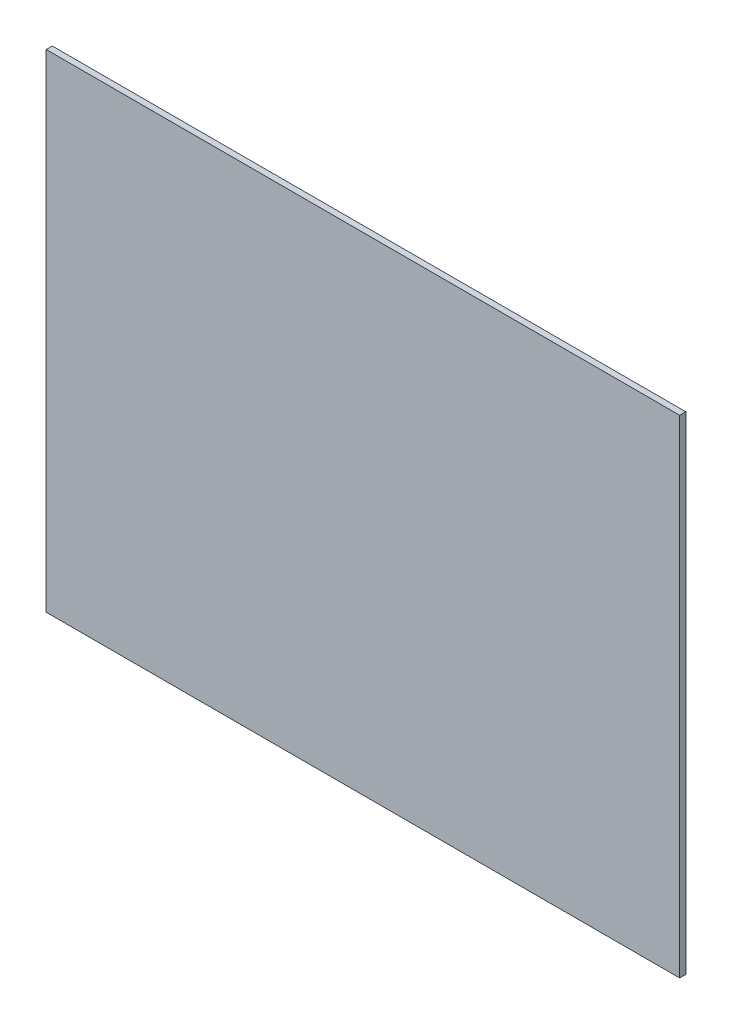
ISO-10303-21;
HEADER;
FILE_DESCRIPTION(('STEP AP214'),'2;1');
FILE_NAME('part.step','',(''),(''),'','','');
FILE_SCHEMA(('AUTOMOTIVE_DESIGN { 1 0 10303 214 1 1 1 1 }'));
ENDSEC;
DATA;
#1=APPLICATION_CONTEXT('core data for automotive mechanical design processes');
#2=APPLICATION_PROTOCOL_DEFINITION('international standard','automotive_design',2000,#1);
#3=PRODUCT_CONTEXT('',#1,'mechanical');
#4=PRODUCT('Part','Part','',(#3));
#5=PRODUCT_RELATED_PRODUCT_CATEGORY('part','',(#4));
#6=PRODUCT_DEFINITION_FORMATION('','',#4);
#7=PRODUCT_DEFINITION_CONTEXT('part definition',#1,'design');
#8=PRODUCT_DEFINITION('design','',#6,#7);
#9=PRODUCT_DEFINITION_SHAPE('','',#8);
#10=(LENGTH_UNIT() NAMED_UNIT(*) SI_UNIT(.MILLI.,.METRE.));
#11=(NAMED_UNIT(*) PLANE_ANGLE_UNIT() SI_UNIT($,.RADIAN.));
#12=(NAMED_UNIT(*) SI_UNIT($,.STERADIAN.) SOLID_ANGLE_UNIT());
#13=UNCERTAINTY_MEASURE_WITH_UNIT(LENGTH_MEASURE(1.E-05),#10,'distance_accuracy_value','');
#14=(GEOMETRIC_REPRESENTATION_CONTEXT(3) GLOBAL_UNCERTAINTY_ASSIGNED_CONTEXT((#13)) GLOBAL_UNIT_ASSIGNED_CONTEXT((#10,
#11,#12)) REPRESENTATION_CONTEXT('',''));
#15=CARTESIAN_POINT('',(0.,0.,0.));
#16=DIRECTION('',(0.,0.,1.));
#17=DIRECTION('',(1.,0.,0.));
#18=AXIS2_PLACEMENT_3D('',#15,#16,#17);
#19=CARTESIAN_POINT('',(-32.0700037546544,24.2769134075616,3.175));
#20=DIRECTION('',(1.,0.,0.));
#21=DIRECTION('',(0.,1.,0.));
#22=AXIS2_PLACEMENT_3D('',#19,#20,#21);
#23=PLANE('',#22);
#24=DIRECTION('',(0.,-1.,0.));
#25=VECTOR('',#24,1.);
#26=CARTESIAN_POINT('',(-32.0700037546544,24.2769134075616,0.));
#27=LINE('',#26,#25);
#28=CARTESIAN_POINT('',(-32.0700037546544,24.2769134075616,0.));
#29=VERTEX_POINT('',#28);
#30=CARTESIAN_POINT('',(-32.0700037546544,-229.723086592438,0.));
#31=VERTEX_POINT('',#30);
#32=EDGE_CURVE('E96',#29,#31,#27,.T.);
#33=ORIENTED_EDGE('',*,*,#32,.T.);
#34=DIRECTION('',(0.,0.,-1.));
#35=VECTOR('',#34,1.);
#36=CARTESIAN_POINT('',(-32.0700037546544,-229.723086592438,3.175));
#37=LINE('',#36,#35);
#38=CARTESIAN_POINT('',(-32.0700037546544,-229.723086592438,3.175));
#39=VERTEX_POINT('',#38);
#40=EDGE_CURVE('E11',#39,#31,#37,.T.);
#41=ORIENTED_EDGE('',*,*,#40,.F.);
#42=DIRECTION('',(0.,-1.,0.));
#43=VECTOR('',#42,1.);
#44=CARTESIAN_POINT('',(-32.0700037546544,24.2769134075616,3.175));
#45=LINE('',#44,#43);
#46=CARTESIAN_POINT('',(-32.0700037546544,24.2769134075616,3.175));
#47=VERTEX_POINT('',#46);
#48=EDGE_CURVE('E84',#47,#39,#45,.T.);
#49=ORIENTED_EDGE('',*,*,#48,.F.);
#50=DIRECTION('',(0.,0.,-1.));
#51=VECTOR('',#50,1.);
#52=CARTESIAN_POINT('',(-32.0700037546544,24.2769134075616,3.175));
#53=LINE('',#52,#51);
#54=EDGE_CURVE('E92',#47,#29,#53,.T.);
#55=ORIENTED_EDGE('',*,*,#54,.T.);
#56=EDGE_LOOP('',(#33,#41,#49,#55));
#57=FACE_BOUND('',#56,.T.);
#58=ADVANCED_FACE('F33',(#57),#23,.F.);
#59=CARTESIAN_POINT('',(-32.0700037546544,-229.723086592438,3.175));
#60=DIRECTION('',(0.,1.,0.));
#61=DIRECTION('',(0.,0.,1.));
#62=AXIS2_PLACEMENT_3D('',#59,#60,#61);
#63=PLANE('',#62);
#64=DIRECTION('',(1.,0.,0.));
#65=VECTOR('',#64,1.);
#66=CARTESIAN_POINT('',(-32.0700037546544,-229.723086592438,0.));
#67=LINE('',#66,#65);
#68=CARTESIAN_POINT('',(298.129996245346,-229.723086592438,0.));
#69=VERTEX_POINT('',#68);
#70=EDGE_CURVE('E88',#31,#69,#67,.T.);
#71=ORIENTED_EDGE('',*,*,#70,.T.);
#72=DIRECTION('',(0.,0.,-1.));
#73=VECTOR('',#72,1.);
#74=CARTESIAN_POINT('',(298.129996245346,-229.723086592438,3.175));
#75=LINE('',#74,#73);
#76=CARTESIAN_POINT('',(298.129996245346,-229.723086592438,3.175));
#77=VERTEX_POINT('',#76);
#78=EDGE_CURVE('E41',#77,#69,#75,.T.);
#79=ORIENTED_EDGE('',*,*,#78,.F.);
#80=DIRECTION('',(1.,0.,0.));
#81=VECTOR('',#80,1.);
#82=CARTESIAN_POINT('',(-32.0700037546544,-229.723086592438,3.175));
#83=LINE('',#82,#81);
#84=EDGE_CURVE('E79',#39,#77,#83,.T.);
#85=ORIENTED_EDGE('',*,*,#84,.F.);
#86=ORIENTED_EDGE('',*,*,#40,.T.);
#87=EDGE_LOOP('',(#71,#79,#85,#86));
#88=FACE_BOUND('',#87,.T.);
#89=ADVANCED_FACE('F87',(#88),#63,.F.);
#90=CARTESIAN_POINT('',(298.129996245346,24.2769134075616,3.175));
#91=DIRECTION('',(-1.,0.,0.));
#92=DIRECTION('',(0.,-1.,0.));
#93=AXIS2_PLACEMENT_3D('',#90,#91,#92);
#94=PLANE('',#93);
#95=DIRECTION('',(0.,1.,0.));
#96=VECTOR('',#95,1.);
#97=CARTESIAN_POINT('',(298.129996245346,24.2769134075616,0.));
#98=LINE('',#97,#96);
#99=CARTESIAN_POINT('',(298.129996245346,24.2769134075616,0.));
#100=VERTEX_POINT('',#99);
#101=EDGE_CURVE('E66',#69,#100,#98,.T.);
#102=ORIENTED_EDGE('',*,*,#101,.T.);
#103=DIRECTION('',(0.,0.,-1.));
#104=VECTOR('',#103,1.);
#105=CARTESIAN_POINT('',(298.129996245346,24.2769134075616,3.175));
#106=LINE('',#105,#104);
#107=CARTESIAN_POINT('',(298.129996245346,24.2769134075616,3.175));
#108=VERTEX_POINT('',#107);
#109=EDGE_CURVE('E89',#108,#100,#106,.T.);
#110=ORIENTED_EDGE('',*,*,#109,.F.);
#111=DIRECTION('',(0.,1.,0.));
#112=VECTOR('',#111,1.);
#113=CARTESIAN_POINT('',(298.129996245346,24.2769134075616,3.175));
#114=LINE('',#113,#112);
#115=EDGE_CURVE('E82',#77,#108,#114,.T.);
#116=ORIENTED_EDGE('',*,*,#115,.F.);
#117=ORIENTED_EDGE('',*,*,#78,.T.);
#118=EDGE_LOOP('',(#102,#110,#116,#117));
#119=FACE_BOUND('',#118,.T.);
#120=ADVANCED_FACE('F90',(#119),#94,.F.);
#121=CARTESIAN_POINT('',(-32.0700037546544,24.2769134075616,3.175));
#122=DIRECTION('',(0.,-1.,0.));
#123=DIRECTION('',(0.,0.,-1.));
#124=AXIS2_PLACEMENT_3D('',#121,#122,#123);
#125=PLANE('',#124);
#126=DIRECTION('',(-1.,0.,0.));
#127=VECTOR('',#126,1.);
#128=CARTESIAN_POINT('',(-32.0700037546544,24.2769134075616,0.));
#129=LINE('',#128,#127);
#130=EDGE_CURVE('E72',#100,#29,#129,.T.);
#131=ORIENTED_EDGE('',*,*,#130,.T.);
#132=ORIENTED_EDGE('',*,*,#54,.F.);
#133=DIRECTION('',(-1.,0.,0.));
#134=VECTOR('',#133,1.);
#135=CARTESIAN_POINT('',(-32.0700037546544,24.2769134075616,3.175));
#136=LINE('',#135,#134);
#137=EDGE_CURVE('E49',#108,#47,#136,.T.);
#138=ORIENTED_EDGE('',*,*,#137,.F.);
#139=ORIENTED_EDGE('',*,*,#109,.T.);
#140=EDGE_LOOP('',(#131,#132,#138,#139));
#141=FACE_BOUND('',#140,.T.);
#142=ADVANCED_FACE('F103',(#141),#125,.F.);
#143=CARTESIAN_POINT('',(0.,0.,3.175));
#144=DIRECTION('',(0.,0.,1.));
#145=DIRECTION('',(1.,0.,0.));
#146=AXIS2_PLACEMENT_3D('',#143,#144,#145);
#147=PLANE('',#146);
#148=ORIENTED_EDGE('',*,*,#48,.T.);
#149=ORIENTED_EDGE('',*,*,#84,.T.);
#150=ORIENTED_EDGE('',*,*,#115,.T.);
#151=ORIENTED_EDGE('',*,*,#137,.T.);
#152=EDGE_LOOP('',(#148,#149,#150,#151));
#153=FACE_BOUND('',#152,.T.);
#154=ADVANCED_FACE('F80',(#153),#147,.T.);
#155=CARTESIAN_POINT('',(0.,0.,0.));
#156=DIRECTION('',(0.,0.,1.));
#157=DIRECTION('',(1.,0.,0.));
#158=AXIS2_PLACEMENT_3D('',#155,#156,#157);
#159=PLANE('',#158);
#160=ORIENTED_EDGE('',*,*,#32,.F.);
#161=ORIENTED_EDGE('',*,*,#130,.F.);
#162=ORIENTED_EDGE('',*,*,#101,.F.);
#163=ORIENTED_EDGE('',*,*,#70,.F.);
#164=EDGE_LOOP('',(#160,#161,#162,#163));
#165=FACE_BOUND('',#164,.T.);
#166=ADVANCED_FACE('F106',(#165),#159,.F.);
#167=CLOSED_SHELL('',(#58,#89,#120,#142,#154,#166));
#168=MANIFOLD_SOLID_BREP('B2',#167);
#169=ADVANCED_BREP_SHAPE_REPRESENTATION('',(#18,#168),#14);
#170=SHAPE_DEFINITION_REPRESENTATION(#9,#169);
ENDSEC;
END-ISO-10303-21;
